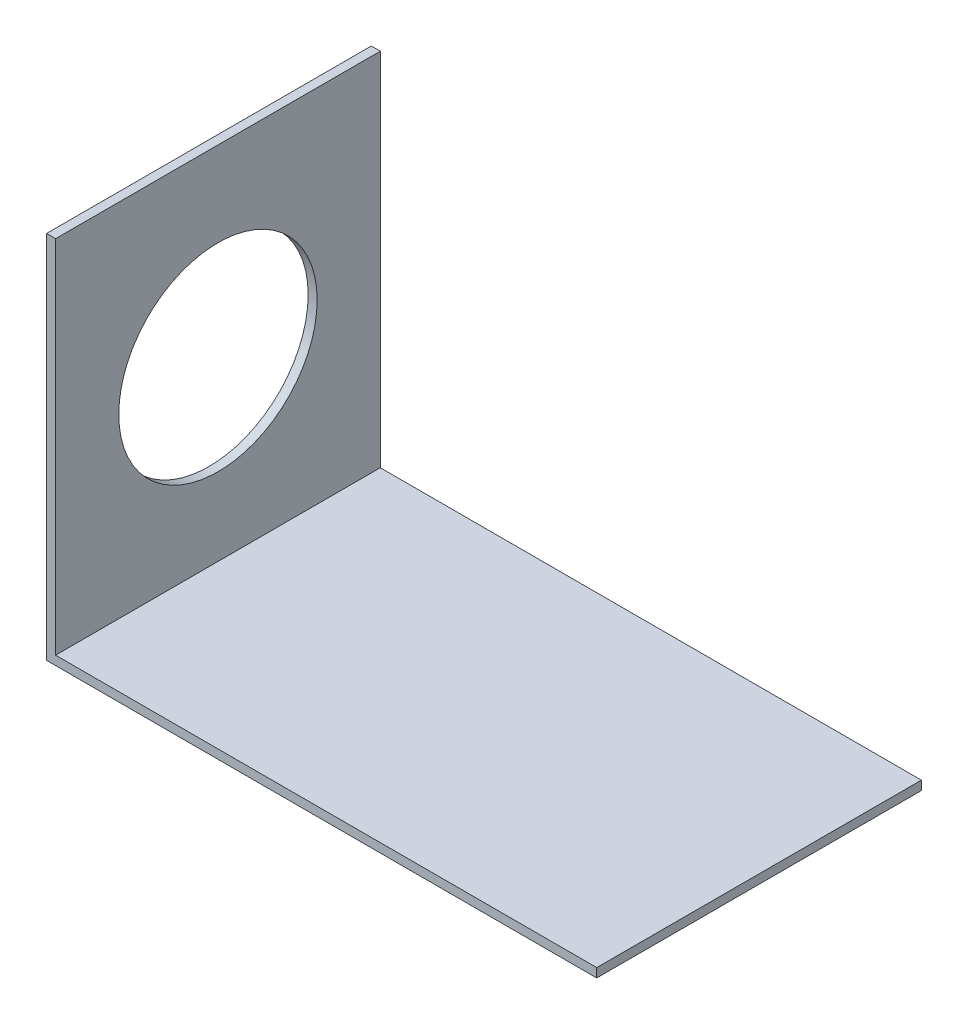
ISO-10303-21;
HEADER;
FILE_DESCRIPTION(('STEP AP214'),'2;1');
FILE_NAME('part.step','',(''),(''),'','','');
FILE_SCHEMA(('AUTOMOTIVE_DESIGN { 1 0 10303 214 1 1 1 1 }'));
ENDSEC;
DATA;
#1=APPLICATION_CONTEXT('core data for automotive mechanical design processes');
#2=APPLICATION_PROTOCOL_DEFINITION('international standard','automotive_design',2000,#1);
#3=PRODUCT_CONTEXT('',#1,'mechanical');
#4=PRODUCT('Part','Part','',(#3));
#5=PRODUCT_RELATED_PRODUCT_CATEGORY('part','',(#4));
#6=PRODUCT_DEFINITION_FORMATION('','',#4);
#7=PRODUCT_DEFINITION_CONTEXT('part definition',#1,'design');
#8=PRODUCT_DEFINITION('design','',#6,#7);
#9=PRODUCT_DEFINITION_SHAPE('','',#8);
#10=(LENGTH_UNIT() NAMED_UNIT(*) SI_UNIT(.MILLI.,.METRE.));
#11=(NAMED_UNIT(*) PLANE_ANGLE_UNIT() SI_UNIT($,.RADIAN.));
#12=(NAMED_UNIT(*) SI_UNIT($,.STERADIAN.) SOLID_ANGLE_UNIT());
#13=UNCERTAINTY_MEASURE_WITH_UNIT(LENGTH_MEASURE(1.E-05),#10,'distance_accuracy_value','');
#14=(GEOMETRIC_REPRESENTATION_CONTEXT(3) GLOBAL_UNCERTAINTY_ASSIGNED_CONTEXT((#13)) GLOBAL_UNIT_ASSIGNED_CONTEXT((#10,
#11,#12)) REPRESENTATION_CONTEXT('',''));
#15=CARTESIAN_POINT('',(0.,0.,0.));
#16=DIRECTION('',(0.,0.,1.));
#17=DIRECTION('',(1.,0.,0.));
#18=AXIS2_PLACEMENT_3D('',#15,#16,#17);
#19=CARTESIAN_POINT('',(-75.8539761049895,40.,36.));
#20=DIRECTION('',(0.,-1.,0.));
#21=DIRECTION('',(0.,0.,-1.));
#22=AXIS2_PLACEMENT_3D('',#19,#20,#21);
#23=PLANE('',#22);
#24=DIRECTION('',(-1.,0.,0.));
#25=VECTOR('',#24,1.);
#26=CARTESIAN_POINT('',(-75.8539761049895,40.,0.));
#27=LINE('',#26,#25);
#28=CARTESIAN_POINT('',(-74.8539761049895,40.,0.));
#29=VERTEX_POINT('',#28);
#30=CARTESIAN_POINT('',(-75.8539761049895,40.,0.));
#31=VERTEX_POINT('',#30);
#32=EDGE_CURVE('E117',#29,#31,#27,.T.);
#33=ORIENTED_EDGE('',*,*,#32,.T.);
#34=DIRECTION('',(0.,0.,-1.));
#35=VECTOR('',#34,1.);
#36=CARTESIAN_POINT('',(-75.8539761049895,40.,36.));
#37=LINE('',#36,#35);
#38=CARTESIAN_POINT('',(-75.8539761049895,40.,36.));
#39=VERTEX_POINT('',#38);
#40=EDGE_CURVE('E11',#39,#31,#37,.T.);
#41=ORIENTED_EDGE('',*,*,#40,.F.);
#42=DIRECTION('',(-1.,0.,0.));
#43=VECTOR('',#42,1.);
#44=CARTESIAN_POINT('',(-75.8539761049895,40.,36.));
#45=LINE('',#44,#43);
#46=CARTESIAN_POINT('',(-74.8539761049895,40.,36.));
#47=VERTEX_POINT('',#46);
#48=EDGE_CURVE('E128',#47,#39,#45,.T.);
#49=ORIENTED_EDGE('',*,*,#48,.F.);
#50=DIRECTION('',(0.,0.,-1.));
#51=VECTOR('',#50,1.);
#52=CARTESIAN_POINT('',(-74.8539761049895,40.,36.));
#53=LINE('',#52,#51);
#54=EDGE_CURVE('E113',#47,#29,#53,.T.);
#55=ORIENTED_EDGE('',*,*,#54,.T.);
#56=EDGE_LOOP('',(#33,#41,#49,#55));
#57=FACE_BOUND('',#56,.T.);
#58=ADVANCED_FACE('F33',(#57),#23,.F.);
#59=CARTESIAN_POINT('',(-75.8539761049895,40.,36.));
#60=DIRECTION('',(1.,0.,0.));
#61=DIRECTION('',(0.,0.,-1.));
#62=AXIS2_PLACEMENT_3D('',#59,#60,#61);
#63=PLANE('',#62);
#64=CARTESIAN_POINT('',(-75.8539761049895,19.61,18.));
#65=DIRECTION('',(1.,0.,0.));
#66=DIRECTION('',(0.,0.,-1.));
#67=AXIS2_PLACEMENT_3D('',#64,#65,#66);
#68=CIRCLE('',#67,11.);
#69=CARTESIAN_POINT('',(-75.8539761049895,19.61,7.));
#70=VERTEX_POINT('',#69);
#71=EDGE_CURVE('E121',#70,#70,#68,.T.);
#72=ORIENTED_EDGE('',*,*,#71,.T.);
#73=EDGE_LOOP('',(#72));
#74=FACE_BOUND('',#73,.T.);
#75=DIRECTION('',(0.,-1.,0.));
#76=VECTOR('',#75,1.);
#77=CARTESIAN_POINT('',(-75.8539761049895,40.,0.));
#78=LINE('',#77,#76);
#79=CARTESIAN_POINT('',(-75.8539761049895,-1.,0.));
#80=VERTEX_POINT('',#79);
#81=EDGE_CURVE('E120',#31,#80,#78,.T.);
#82=ORIENTED_EDGE('',*,*,#81,.T.);
#83=DIRECTION('',(0.,0.,-1.));
#84=VECTOR('',#83,1.);
#85=CARTESIAN_POINT('',(-75.8539761049895,-1.,36.));
#86=LINE('',#85,#84);
#87=CARTESIAN_POINT('',(-75.8539761049895,-1.,36.));
#88=VERTEX_POINT('',#87);
#89=EDGE_CURVE('E41',#88,#80,#86,.T.);
#90=ORIENTED_EDGE('',*,*,#89,.F.);
#91=DIRECTION('',(0.,-1.,0.));
#92=VECTOR('',#91,1.);
#93=CARTESIAN_POINT('',(-75.8539761049895,40.,36.));
#94=LINE('',#93,#92);
#95=EDGE_CURVE('E86',#39,#88,#94,.T.);
#96=ORIENTED_EDGE('',*,*,#95,.F.);
#97=ORIENTED_EDGE('',*,*,#40,.T.);
#98=EDGE_LOOP('',(#82,#90,#96,#97));
#99=FACE_BOUND('',#98,.T.);
#100=ADVANCED_FACE('F154',(#74,#99),#63,.F.);
#101=CARTESIAN_POINT('',(-75.8539761049895,-1.,36.));
#102=DIRECTION('',(0.,1.,0.));
#103=DIRECTION('',(0.,0.,1.));
#104=AXIS2_PLACEMENT_3D('',#101,#102,#103);
#105=PLANE('',#104);
#106=DIRECTION('',(1.,0.,0.));
#107=VECTOR('',#106,1.);
#108=CARTESIAN_POINT('',(-75.8539761049895,-1.,0.));
#109=LINE('',#108,#107);
#110=CARTESIAN_POINT('',(-14.8539761049895,-1.,0.));
#111=VERTEX_POINT('',#110);
#112=EDGE_CURVE('E123',#80,#111,#109,.T.);
#113=ORIENTED_EDGE('',*,*,#112,.T.);
#114=DIRECTION('',(0.,0.,-1.));
#115=VECTOR('',#114,1.);
#116=CARTESIAN_POINT('',(-14.8539761049895,-1.,36.));
#117=LINE('',#116,#115);
#118=CARTESIAN_POINT('',(-14.8539761049895,-1.,36.));
#119=VERTEX_POINT('',#118);
#120=EDGE_CURVE('E108',#119,#111,#117,.T.);
#121=ORIENTED_EDGE('',*,*,#120,.F.);
#122=DIRECTION('',(1.,0.,0.));
#123=VECTOR('',#122,1.);
#124=CARTESIAN_POINT('',(-75.8539761049895,-1.,36.));
#125=LINE('',#124,#123);
#126=EDGE_CURVE('E99',#88,#119,#125,.T.);
#127=ORIENTED_EDGE('',*,*,#126,.F.);
#128=ORIENTED_EDGE('',*,*,#89,.T.);
#129=EDGE_LOOP('',(#113,#121,#127,#128));
#130=FACE_BOUND('',#129,.T.);
#131=ADVANCED_FACE('F134',(#130),#105,.F.);
#132=CARTESIAN_POINT('',(-14.8539761049895,0.,36.));
#133=DIRECTION('',(-1.,0.,0.));
#134=DIRECTION('',(0.,0.,1.));
#135=AXIS2_PLACEMENT_3D('',#132,#133,#134);
#136=PLANE('',#135);
#137=DIRECTION('',(0.,1.,0.));
#138=VECTOR('',#137,1.);
#139=CARTESIAN_POINT('',(-14.8539761049895,0.,0.));
#140=LINE('',#139,#138);
#141=CARTESIAN_POINT('',(-14.8539761049895,0.,0.));
#142=VERTEX_POINT('',#141);
#143=EDGE_CURVE('E107',#111,#142,#140,.T.);
#144=ORIENTED_EDGE('',*,*,#143,.T.);
#145=DIRECTION('',(0.,0.,-1.));
#146=VECTOR('',#145,1.);
#147=CARTESIAN_POINT('',(-14.8539761049895,0.,36.));
#148=LINE('',#147,#146);
#149=CARTESIAN_POINT('',(-14.8539761049895,0.,36.));
#150=VERTEX_POINT('',#149);
#151=EDGE_CURVE('E104',#150,#142,#148,.T.);
#152=ORIENTED_EDGE('',*,*,#151,.F.);
#153=DIRECTION('',(0.,1.,0.));
#154=VECTOR('',#153,1.);
#155=CARTESIAN_POINT('',(-14.8539761049895,0.,36.));
#156=LINE('',#155,#154);
#157=EDGE_CURVE('E93',#119,#150,#156,.T.);
#158=ORIENTED_EDGE('',*,*,#157,.F.);
#159=ORIENTED_EDGE('',*,*,#120,.T.);
#160=EDGE_LOOP('',(#144,#152,#158,#159));
#161=FACE_BOUND('',#160,.T.);
#162=ADVANCED_FACE('F105',(#161),#136,.F.);
#163=CARTESIAN_POINT('',(-74.8539761049895,0.,36.));
#164=DIRECTION('',(0.,-1.,0.));
#165=DIRECTION('',(0.,0.,-1.));
#166=AXIS2_PLACEMENT_3D('',#163,#164,#165);
#167=PLANE('',#166);
#168=DIRECTION('',(-1.,0.,0.));
#169=VECTOR('',#168,1.);
#170=CARTESIAN_POINT('',(-74.8539761049895,0.,0.));
#171=LINE('',#170,#169);
#172=CARTESIAN_POINT('',(-74.8539761049895,0.,0.));
#173=VERTEX_POINT('',#172);
#174=EDGE_CURVE('E72',#142,#173,#171,.T.);
#175=ORIENTED_EDGE('',*,*,#174,.T.);
#176=DIRECTION('',(0.,0.,-1.));
#177=VECTOR('',#176,1.);
#178=CARTESIAN_POINT('',(-74.8539761049895,0.,36.));
#179=LINE('',#178,#177);
#180=CARTESIAN_POINT('',(-74.8539761049895,0.,36.));
#181=VERTEX_POINT('',#180);
#182=EDGE_CURVE('E109',#181,#173,#179,.T.);
#183=ORIENTED_EDGE('',*,*,#182,.F.);
#184=DIRECTION('',(-1.,0.,0.));
#185=VECTOR('',#184,1.);
#186=CARTESIAN_POINT('',(-74.8539761049895,0.,36.));
#187=LINE('',#186,#185);
#188=EDGE_CURVE('E97',#150,#181,#187,.T.);
#189=ORIENTED_EDGE('',*,*,#188,.F.);
#190=ORIENTED_EDGE('',*,*,#151,.T.);
#191=EDGE_LOOP('',(#175,#183,#189,#190));
#192=FACE_BOUND('',#191,.T.);
#193=ADVANCED_FACE('F111',(#192),#167,.F.);
#194=CARTESIAN_POINT('',(-74.8539761049895,40.,36.));
#195=DIRECTION('',(-1.,0.,0.));
#196=DIRECTION('',(0.,0.,1.));
#197=AXIS2_PLACEMENT_3D('',#194,#195,#196);
#198=PLANE('',#197);
#199=CARTESIAN_POINT('',(-74.8539761049895,19.61,18.));
#200=DIRECTION('',(1.,0.,0.));
#201=DIRECTION('',(0.,0.,-1.));
#202=AXIS2_PLACEMENT_3D('',#199,#200,#201);
#203=CIRCLE('',#202,11.);
#204=CARTESIAN_POINT('',(-74.8539761049895,19.61,7.));
#205=VERTEX_POINT('',#204);
#206=EDGE_CURVE('E213',#205,#205,#203,.T.);
#207=ORIENTED_EDGE('',*,*,#206,.F.);
#208=EDGE_LOOP('',(#207));
#209=FACE_BOUND('',#208,.T.);
#210=DIRECTION('',(0.,1.,0.));
#211=VECTOR('',#210,1.);
#212=CARTESIAN_POINT('',(-74.8539761049895,40.,0.));
#213=LINE('',#212,#211);
#214=EDGE_CURVE('E78',#173,#29,#213,.T.);
#215=ORIENTED_EDGE('',*,*,#214,.T.);
#216=ORIENTED_EDGE('',*,*,#54,.F.);
#217=DIRECTION('',(0.,1.,0.));
#218=VECTOR('',#217,1.);
#219=CARTESIAN_POINT('',(-74.8539761049895,40.,36.));
#220=LINE('',#219,#218);
#221=EDGE_CURVE('E49',#181,#47,#220,.T.);
#222=ORIENTED_EDGE('',*,*,#221,.F.);
#223=ORIENTED_EDGE('',*,*,#182,.T.);
#224=EDGE_LOOP('',(#215,#216,#222,#223));
#225=FACE_BOUND('',#224,.T.);
#226=ADVANCED_FACE('F141',(#209,#225),#198,.F.);
#227=CARTESIAN_POINT('',(0.,0.,36.));
#228=DIRECTION('',(0.,0.,-1.));
#229=DIRECTION('',(-1.,0.,0.));
#230=AXIS2_PLACEMENT_3D('',#227,#228,#229);
#231=PLANE('',#230);
#232=ORIENTED_EDGE('',*,*,#48,.T.);
#233=ORIENTED_EDGE('',*,*,#95,.T.);
#234=ORIENTED_EDGE('',*,*,#126,.T.);
#235=ORIENTED_EDGE('',*,*,#157,.T.);
#236=ORIENTED_EDGE('',*,*,#188,.T.);
#237=ORIENTED_EDGE('',*,*,#221,.T.);
#238=EDGE_LOOP('',(#232,#233,#234,#235,#236,#237));
#239=FACE_BOUND('',#238,.T.);
#240=ADVANCED_FACE('F95',(#239),#231,.F.);
#241=CARTESIAN_POINT('',(0.,0.,0.));
#242=DIRECTION('',(0.,0.,-1.));
#243=DIRECTION('',(-1.,0.,0.));
#244=AXIS2_PLACEMENT_3D('',#241,#242,#243);
#245=PLANE('',#244);
#246=ORIENTED_EDGE('',*,*,#32,.F.);
#247=ORIENTED_EDGE('',*,*,#214,.F.);
#248=ORIENTED_EDGE('',*,*,#174,.F.);
#249=ORIENTED_EDGE('',*,*,#143,.F.);
#250=ORIENTED_EDGE('',*,*,#112,.F.);
#251=ORIENTED_EDGE('',*,*,#81,.F.);
#252=EDGE_LOOP('',(#246,#247,#248,#249,#250,#251));
#253=FACE_BOUND('',#252,.T.);
#254=ADVANCED_FACE('F137',(#253),#245,.T.);
#255=CARTESIAN_POINT('',(-114.853976104989,19.61,18.));
#256=DIRECTION('',(1.,0.,0.));
#257=DIRECTION('',(0.,0.,-1.));
#258=AXIS2_PLACEMENT_3D('',#255,#256,#257);
#259=CYLINDRICAL_SURFACE('',#258,11.);
#260=ORIENTED_EDGE('',*,*,#206,.T.);
#261=EDGE_LOOP('',(#260));
#262=FACE_BOUND('',#261,.T.);
#263=ORIENTED_EDGE('',*,*,#71,.F.);
#264=EDGE_LOOP('',(#263));
#265=FACE_BOUND('',#264,.T.);
#266=ADVANCED_FACE('F189',(#262,#265),#259,.F.);
#267=CLOSED_SHELL('',(#58,#100,#131,#162,#193,#226,#240,#254,#266));
#268=MANIFOLD_SOLID_BREP('B2',#267);
#269=ADVANCED_BREP_SHAPE_REPRESENTATION('',(#18,#268),#14);
#270=SHAPE_DEFINITION_REPRESENTATION(#9,#269);
ENDSEC;
END-ISO-10303-21;
